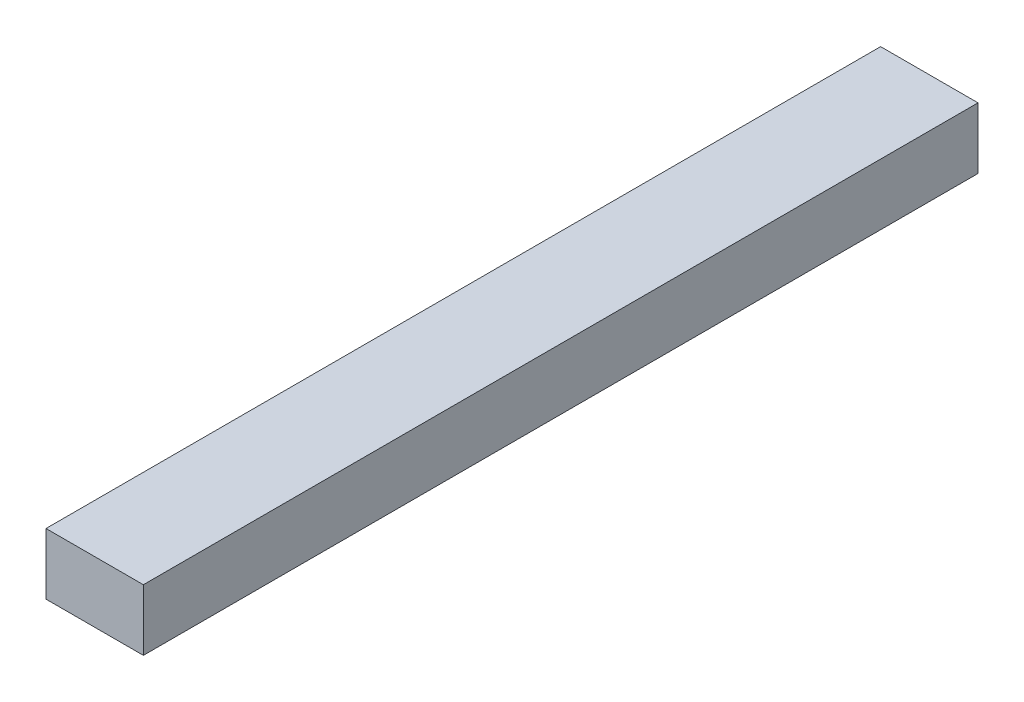
ISO-10303-21;
HEADER;
FILE_DESCRIPTION(('STEP AP214'),'2;1');
FILE_NAME('part.step','',(''),(''),'','','');
FILE_SCHEMA(('AUTOMOTIVE_DESIGN { 1 0 10303 214 1 1 1 1 }'));
ENDSEC;
DATA;
#1=APPLICATION_CONTEXT('core data for automotive mechanical design processes');
#2=APPLICATION_PROTOCOL_DEFINITION('international standard','automotive_design',2000,#1);
#3=PRODUCT_CONTEXT('',#1,'mechanical');
#4=PRODUCT('Part','Part','',(#3));
#5=PRODUCT_RELATED_PRODUCT_CATEGORY('part','',(#4));
#6=PRODUCT_DEFINITION_FORMATION('','',#4);
#7=PRODUCT_DEFINITION_CONTEXT('part definition',#1,'design');
#8=PRODUCT_DEFINITION('design','',#6,#7);
#9=PRODUCT_DEFINITION_SHAPE('','',#8);
#10=(LENGTH_UNIT() NAMED_UNIT(*) SI_UNIT(.MILLI.,.METRE.));
#11=(NAMED_UNIT(*) PLANE_ANGLE_UNIT() SI_UNIT($,.RADIAN.));
#12=(NAMED_UNIT(*) SI_UNIT($,.STERADIAN.) SOLID_ANGLE_UNIT());
#13=UNCERTAINTY_MEASURE_WITH_UNIT(LENGTH_MEASURE(1.E-05),#10,'distance_accuracy_value','');
#14=(GEOMETRIC_REPRESENTATION_CONTEXT(3) GLOBAL_UNCERTAINTY_ASSIGNED_CONTEXT((#13)) GLOBAL_UNIT_ASSIGNED_CONTEXT((#10,
#11,#12)) REPRESENTATION_CONTEXT('',''));
#15=CARTESIAN_POINT('',(0.,0.,0.));
#16=DIRECTION('',(0.,0.,1.));
#17=DIRECTION('',(1.,0.,0.));
#18=AXIS2_PLACEMENT_3D('',#15,#16,#17);
#19=CARTESIAN_POINT('',(0.,0.,600.));
#20=DIRECTION('',(1.,0.,0.));
#21=DIRECTION('',(0.,1.,0.));
#22=AXIS2_PLACEMENT_3D('',#19,#20,#21);
#23=PLANE('',#22);
#24=DIRECTION('',(0.,-1.,0.));
#25=VECTOR('',#24,1.);
#26=CARTESIAN_POINT('',(0.,0.,0.));
#27=LINE('',#26,#25);
#28=CARTESIAN_POINT('',(0.,44.,0.));
#29=VERTEX_POINT('',#28);
#30=CARTESIAN_POINT('',(0.,0.,0.));
#31=VERTEX_POINT('',#30);
#32=EDGE_CURVE('E94',#29,#31,#27,.T.);
#33=ORIENTED_EDGE('',*,*,#32,.T.);
#34=DIRECTION('',(0.,0.,-1.));
#35=VECTOR('',#34,1.);
#36=CARTESIAN_POINT('',(0.,0.,600.));
#37=LINE('',#36,#35);
#38=CARTESIAN_POINT('',(0.,0.,600.));
#39=VERTEX_POINT('',#38);
#40=EDGE_CURVE('E11',#39,#31,#37,.T.);
#41=ORIENTED_EDGE('',*,*,#40,.F.);
#42=DIRECTION('',(0.,-1.,0.));
#43=VECTOR('',#42,1.);
#44=CARTESIAN_POINT('',(0.,0.,600.));
#45=LINE('',#44,#43);
#46=CARTESIAN_POINT('',(0.,44.,600.));
#47=VERTEX_POINT('',#46);
#48=EDGE_CURVE('E82',#47,#39,#45,.T.);
#49=ORIENTED_EDGE('',*,*,#48,.F.);
#50=DIRECTION('',(0.,0.,-1.));
#51=VECTOR('',#50,1.);
#52=CARTESIAN_POINT('',(0.,44.,600.));
#53=LINE('',#52,#51);
#54=EDGE_CURVE('E90',#47,#29,#53,.T.);
#55=ORIENTED_EDGE('',*,*,#54,.T.);
#56=EDGE_LOOP('',(#33,#41,#49,#55));
#57=FACE_BOUND('',#56,.T.);
#58=ADVANCED_FACE('F31',(#57),#23,.F.);
#59=CARTESIAN_POINT('',(0.,0.,600.));
#60=DIRECTION('',(0.,1.,0.));
#61=DIRECTION('',(0.,0.,1.));
#62=AXIS2_PLACEMENT_3D('',#59,#60,#61);
#63=PLANE('',#62);
#64=DIRECTION('',(1.,0.,0.));
#65=VECTOR('',#64,1.);
#66=CARTESIAN_POINT('',(0.,0.,0.));
#67=LINE('',#66,#65);
#68=CARTESIAN_POINT('',(70.,0.,0.));
#69=VERTEX_POINT('',#68);
#70=EDGE_CURVE('E86',#31,#69,#67,.T.);
#71=ORIENTED_EDGE('',*,*,#70,.T.);
#72=DIRECTION('',(0.,0.,-1.));
#73=VECTOR('',#72,1.);
#74=CARTESIAN_POINT('',(70.,0.,600.));
#75=LINE('',#74,#73);
#76=CARTESIAN_POINT('',(70.,0.,600.));
#77=VERTEX_POINT('',#76);
#78=EDGE_CURVE('E39',#77,#69,#75,.T.);
#79=ORIENTED_EDGE('',*,*,#78,.F.);
#80=DIRECTION('',(1.,0.,0.));
#81=VECTOR('',#80,1.);
#82=CARTESIAN_POINT('',(0.,0.,600.));
#83=LINE('',#82,#81);
#84=EDGE_CURVE('E77',#39,#77,#83,.T.);
#85=ORIENTED_EDGE('',*,*,#84,.F.);
#86=ORIENTED_EDGE('',*,*,#40,.T.);
#87=EDGE_LOOP('',(#71,#79,#85,#86));
#88=FACE_BOUND('',#87,.T.);
#89=ADVANCED_FACE('F85',(#88),#63,.F.);
#90=CARTESIAN_POINT('',(70.,0.,600.));
#91=DIRECTION('',(-1.,0.,0.));
#92=DIRECTION('',(0.,-1.,0.));
#93=AXIS2_PLACEMENT_3D('',#90,#91,#92);
#94=PLANE('',#93);
#95=DIRECTION('',(0.,1.,0.));
#96=VECTOR('',#95,1.);
#97=CARTESIAN_POINT('',(70.,0.,0.));
#98=LINE('',#97,#96);
#99=CARTESIAN_POINT('',(70.,44.,0.));
#100=VERTEX_POINT('',#99);
#101=EDGE_CURVE('E64',#69,#100,#98,.T.);
#102=ORIENTED_EDGE('',*,*,#101,.T.);
#103=DIRECTION('',(0.,0.,-1.));
#104=VECTOR('',#103,1.);
#105=CARTESIAN_POINT('',(70.,44.,600.));
#106=LINE('',#105,#104);
#107=CARTESIAN_POINT('',(70.,44.,600.));
#108=VERTEX_POINT('',#107);
#109=EDGE_CURVE('E87',#108,#100,#106,.T.);
#110=ORIENTED_EDGE('',*,*,#109,.F.);
#111=DIRECTION('',(0.,1.,0.));
#112=VECTOR('',#111,1.);
#113=CARTESIAN_POINT('',(70.,0.,600.));
#114=LINE('',#113,#112);
#115=EDGE_CURVE('E80',#77,#108,#114,.T.);
#116=ORIENTED_EDGE('',*,*,#115,.F.);
#117=ORIENTED_EDGE('',*,*,#78,.T.);
#118=EDGE_LOOP('',(#102,#110,#116,#117));
#119=FACE_BOUND('',#118,.T.);
#120=ADVANCED_FACE('F88',(#119),#94,.F.);
#121=CARTESIAN_POINT('',(0.,44.,600.));
#122=DIRECTION('',(0.,-1.,0.));
#123=DIRECTION('',(0.,0.,-1.));
#124=AXIS2_PLACEMENT_3D('',#121,#122,#123);
#125=PLANE('',#124);
#126=DIRECTION('',(-1.,0.,0.));
#127=VECTOR('',#126,1.);
#128=CARTESIAN_POINT('',(0.,44.,0.));
#129=LINE('',#128,#127);
#130=EDGE_CURVE('E70',#100,#29,#129,.T.);
#131=ORIENTED_EDGE('',*,*,#130,.T.);
#132=ORIENTED_EDGE('',*,*,#54,.F.);
#133=DIRECTION('',(-1.,0.,0.));
#134=VECTOR('',#133,1.);
#135=CARTESIAN_POINT('',(0.,44.,600.));
#136=LINE('',#135,#134);
#137=EDGE_CURVE('E47',#108,#47,#136,.T.);
#138=ORIENTED_EDGE('',*,*,#137,.F.);
#139=ORIENTED_EDGE('',*,*,#109,.T.);
#140=EDGE_LOOP('',(#131,#132,#138,#139));
#141=FACE_BOUND('',#140,.T.);
#142=ADVANCED_FACE('F101',(#141),#125,.F.);
#143=CARTESIAN_POINT('',(0.,44.,600.));
#144=DIRECTION('',(0.,0.,-1.));
#145=DIRECTION('',(-1.,0.,0.));
#146=AXIS2_PLACEMENT_3D('',#143,#144,#145);
#147=PLANE('',#146);
#148=ORIENTED_EDGE('',*,*,#48,.T.);
#149=ORIENTED_EDGE('',*,*,#84,.T.);
#150=ORIENTED_EDGE('',*,*,#115,.T.);
#151=ORIENTED_EDGE('',*,*,#137,.T.);
#152=EDGE_LOOP('',(#148,#149,#150,#151));
#153=FACE_BOUND('',#152,.T.);
#154=ADVANCED_FACE('F78',(#153),#147,.F.);
#155=CARTESIAN_POINT('',(0.,44.,0.));
#156=DIRECTION('',(0.,0.,-1.));
#157=DIRECTION('',(-1.,0.,0.));
#158=AXIS2_PLACEMENT_3D('',#155,#156,#157);
#159=PLANE('',#158);
#160=ORIENTED_EDGE('',*,*,#32,.F.);
#161=ORIENTED_EDGE('',*,*,#130,.F.);
#162=ORIENTED_EDGE('',*,*,#101,.F.);
#163=ORIENTED_EDGE('',*,*,#70,.F.);
#164=EDGE_LOOP('',(#160,#161,#162,#163));
#165=FACE_BOUND('',#164,.T.);
#166=ADVANCED_FACE('F104',(#165),#159,.T.);
#167=CLOSED_SHELL('',(#58,#89,#120,#142,#154,#166));
#168=MANIFOLD_SOLID_BREP('B2',#167);
#169=ADVANCED_BREP_SHAPE_REPRESENTATION('',(#18,#168),#14);
#170=SHAPE_DEFINITION_REPRESENTATION(#9,#169);
ENDSEC;
END-ISO-10303-21;
